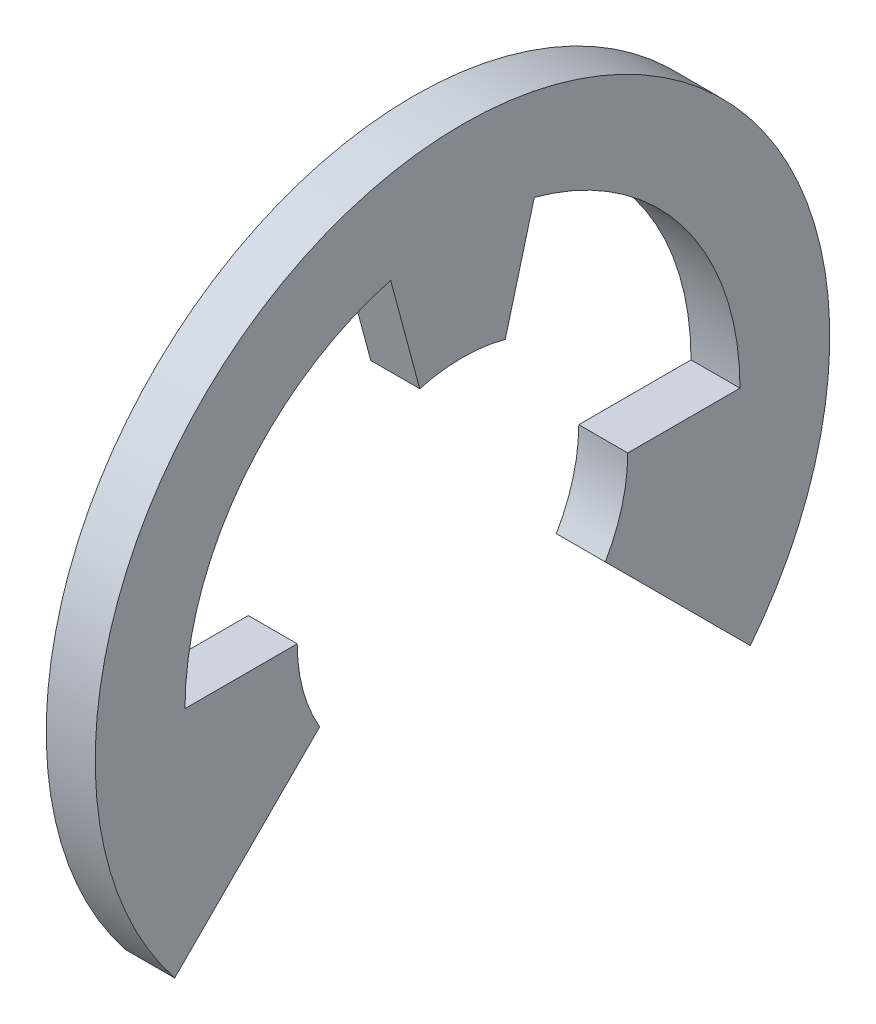
ISO-10303-21;
HEADER;
FILE_DESCRIPTION(('STEP AP214'),'2;1');
FILE_NAME('part.step','',(''),(''),'','','');
FILE_SCHEMA(('AUTOMOTIVE_DESIGN { 1 0 10303 214 1 1 1 1 }'));
ENDSEC;
DATA;
#1=APPLICATION_CONTEXT('core data for automotive mechanical design processes');
#2=APPLICATION_PROTOCOL_DEFINITION('international standard','automotive_design',2000,#1);
#3=PRODUCT_CONTEXT('',#1,'mechanical');
#4=PRODUCT('Part','Part','',(#3));
#5=PRODUCT_RELATED_PRODUCT_CATEGORY('part','',(#4));
#6=PRODUCT_DEFINITION_FORMATION('','',#4);
#7=PRODUCT_DEFINITION_CONTEXT('part definition',#1,'design');
#8=PRODUCT_DEFINITION('design','',#6,#7);
#9=PRODUCT_DEFINITION_SHAPE('','',#8);
#10=(LENGTH_UNIT() NAMED_UNIT(*) SI_UNIT(.MILLI.,.METRE.));
#11=(NAMED_UNIT(*) PLANE_ANGLE_UNIT() SI_UNIT($,.RADIAN.));
#12=(NAMED_UNIT(*) SI_UNIT($,.STERADIAN.) SOLID_ANGLE_UNIT());
#13=UNCERTAINTY_MEASURE_WITH_UNIT(LENGTH_MEASURE(1.E-05),#10,'distance_accuracy_value','');
#14=(GEOMETRIC_REPRESENTATION_CONTEXT(3) GLOBAL_UNCERTAINTY_ASSIGNED_CONTEXT((#13)) GLOBAL_UNIT_ASSIGNED_CONTEXT((#10,
#11,#12)) REPRESENTATION_CONTEXT('',''));
#15=CARTESIAN_POINT('',(0.,0.,0.));
#16=DIRECTION('',(0.,0.,1.));
#17=DIRECTION('',(1.,0.,0.));
#18=AXIS2_PLACEMENT_3D('',#15,#16,#17);
#19=CARTESIAN_POINT('',(0.6,0.,0.));
#20=DIRECTION('',(-1.,0.,0.));
#21=DIRECTION('',(0.,0.,1.));
#22=AXIS2_PLACEMENT_3D('',#19,#20,#21);
#23=CYLINDRICAL_SURFACE('',#22,2.025);
#24=CARTESIAN_POINT('',(0.,0.,0.));
#25=DIRECTION('',(-1.,0.,0.));
#26=DIRECTION('',(0.,0.,-1.));
#27=AXIS2_PLACEMENT_3D('',#24,#25,#26);
#28=CIRCLE('',#27,2.025);
#29=CARTESIAN_POINT('',(0.,-1.01888419361574,1.75));
#30=VERTEX_POINT('',#29);
#31=CARTESIAN_POINT('',(0.,0.,2.025));
#32=VERTEX_POINT('',#31);
#33=EDGE_CURVE('E155',#30,#32,#28,.T.);
#34=ORIENTED_EDGE('',*,*,#33,.T.);
#35=DIRECTION('',(-1.,0.,0.));
#36=VECTOR('',#35,1.);
#37=CARTESIAN_POINT('',(0.6,0.,2.025));
#38=LINE('',#37,#36);
#39=CARTESIAN_POINT('',(0.6,0.,2.025));
#40=VERTEX_POINT('',#39);
#41=EDGE_CURVE('E11',#40,#32,#38,.T.);
#42=ORIENTED_EDGE('',*,*,#41,.F.);
#43=CARTESIAN_POINT('',(0.6,0.,0.));
#44=DIRECTION('',(-1.,0.,0.));
#45=DIRECTION('',(0.,0.,-1.));
#46=AXIS2_PLACEMENT_3D('',#43,#44,#45);
#47=CIRCLE('',#46,2.025);
#48=CARTESIAN_POINT('',(0.6,-1.01888419361574,1.75));
#49=VERTEX_POINT('',#48);
#50=EDGE_CURVE('E177',#49,#40,#47,.T.);
#51=ORIENTED_EDGE('',*,*,#50,.F.);
#52=DIRECTION('',(-1.,0.,0.));
#53=VECTOR('',#52,1.);
#54=CARTESIAN_POINT('',(0.6,-1.01888419361574,1.75));
#55=LINE('',#54,#53);
#56=EDGE_CURVE('E151',#49,#30,#55,.T.);
#57=ORIENTED_EDGE('',*,*,#56,.T.);
#58=EDGE_LOOP('',(#34,#42,#51,#57));
#59=FACE_BOUND('',#58,.T.);
#60=ADVANCED_FACE('F35',(#59),#23,.F.);
#61=CARTESIAN_POINT('',(0.6,0.,2.025));
#62=DIRECTION('',(0.,-1.,0.));
#63=DIRECTION('',(0.,0.,-1.));
#64=AXIS2_PLACEMENT_3D('',#61,#62,#63);
#65=PLANE('',#64);
#66=DIRECTION('',(0.,0.,1.));
#67=VECTOR('',#66,1.);
#68=CARTESIAN_POINT('',(0.,0.,2.025));
#69=LINE('',#68,#67);
#70=CARTESIAN_POINT('',(0.,0.,3.4));
#71=VERTEX_POINT('',#70);
#72=EDGE_CURVE('E158',#32,#71,#69,.T.);
#73=ORIENTED_EDGE('',*,*,#72,.T.);
#74=DIRECTION('',(-1.,0.,0.));
#75=VECTOR('',#74,1.);
#76=CARTESIAN_POINT('',(0.6,0.,3.4));
#77=LINE('',#76,#75);
#78=CARTESIAN_POINT('',(0.6,0.,3.4));
#79=VERTEX_POINT('',#78);
#80=EDGE_CURVE('E43',#79,#71,#77,.T.);
#81=ORIENTED_EDGE('',*,*,#80,.F.);
#82=DIRECTION('',(0.,0.,1.));
#83=VECTOR('',#82,1.);
#84=CARTESIAN_POINT('',(0.6,0.,2.025));
#85=LINE('',#84,#83);
#86=EDGE_CURVE('E106',#40,#79,#85,.T.);
#87=ORIENTED_EDGE('',*,*,#86,.F.);
#88=ORIENTED_EDGE('',*,*,#41,.T.);
#89=EDGE_LOOP('',(#73,#81,#87,#88));
#90=FACE_BOUND('',#89,.T.);
#91=ADVANCED_FACE('F255',(#90),#65,.F.);
#92=CARTESIAN_POINT('',(0.6,0.,0.));
#93=DIRECTION('',(-1.,0.,0.));
#94=DIRECTION('',(0.,0.,1.));
#95=AXIS2_PLACEMENT_3D('',#92,#93,#94);
#96=CYLINDRICAL_SURFACE('',#95,3.4);
#97=CARTESIAN_POINT('',(0.,0.,0.));
#98=DIRECTION('',(-1.,0.,0.));
#99=DIRECTION('',(0.,0.,-1.));
#100=AXIS2_PLACEMENT_3D('',#97,#98,#99);
#101=CIRCLE('',#100,3.4);
#102=CARTESIAN_POINT('',(0.,3.28414780938282,0.879984753348611));
#103=VERTEX_POINT('',#102);
#104=EDGE_CURVE('E160',#71,#103,#101,.T.);
#105=ORIENTED_EDGE('',*,*,#104,.T.);
#106=DIRECTION('',(-1.,0.,0.));
#107=VECTOR('',#106,1.);
#108=CARTESIAN_POINT('',(0.6,3.28414780938282,0.879984753348611));
#109=LINE('',#108,#107);
#110=CARTESIAN_POINT('',(0.6,3.28414780938282,0.879984753348611));
#111=VERTEX_POINT('',#110);
#112=EDGE_CURVE('E196',#111,#103,#109,.T.);
#113=ORIENTED_EDGE('',*,*,#112,.F.);
#114=CARTESIAN_POINT('',(0.6,0.,0.));
#115=DIRECTION('',(-1.,0.,0.));
#116=DIRECTION('',(0.,0.,-1.));
#117=AXIS2_PLACEMENT_3D('',#114,#115,#116);
#118=CIRCLE('',#117,3.4);
#119=EDGE_CURVE('E204',#79,#111,#118,.T.);
#120=ORIENTED_EDGE('',*,*,#119,.F.);
#121=ORIENTED_EDGE('',*,*,#80,.T.);
#122=EDGE_LOOP('',(#105,#113,#120,#121));
#123=FACE_BOUND('',#122,.T.);
#124=ADVANCED_FACE('F202',(#123),#96,.F.);
#125=CARTESIAN_POINT('',(0.6,1.95599979823536,0.524108566332629));
#126=DIRECTION('',(0.,0.258819045102533,-0.965925826289065));
#127=DIRECTION('',(0.,0.965925826289065,0.258819045102533));
#128=AXIS2_PLACEMENT_3D('',#125,#126,#127);
#129=PLANE('',#128);
#130=DIRECTION('',(0.,-0.965925826289065,-0.258819045102533));
#131=VECTOR('',#130,1.);
#132=CARTESIAN_POINT('',(0.,1.95599979823536,0.524108566332629));
#133=LINE('',#132,#131);
#134=CARTESIAN_POINT('',(0.,1.95599979823536,0.524108566332629));
#135=VERTEX_POINT('',#134);
#136=EDGE_CURVE('E162',#103,#135,#133,.T.);
#137=ORIENTED_EDGE('',*,*,#136,.T.);
#138=DIRECTION('',(-1.,0.,0.));
#139=VECTOR('',#138,1.);
#140=CARTESIAN_POINT('',(0.6,1.95599979823536,0.524108566332629));
#141=LINE('',#140,#139);
#142=CARTESIAN_POINT('',(0.6,1.95599979823536,0.524108566332629));
#143=VERTEX_POINT('',#142);
#144=EDGE_CURVE('E193',#143,#135,#141,.T.);
#145=ORIENTED_EDGE('',*,*,#144,.F.);
#146=DIRECTION('',(0.,-0.965925826289065,-0.258819045102533));
#147=VECTOR('',#146,1.);
#148=CARTESIAN_POINT('',(0.6,1.95599979823536,0.524108566332629));
#149=LINE('',#148,#147);
#150=EDGE_CURVE('E222',#111,#143,#149,.T.);
#151=ORIENTED_EDGE('',*,*,#150,.F.);
#152=ORIENTED_EDGE('',*,*,#112,.T.);
#153=EDGE_LOOP('',(#137,#145,#151,#152));
#154=FACE_BOUND('',#153,.T.);
#155=ADVANCED_FACE('F213',(#154),#129,.F.);
#156=CARTESIAN_POINT('',(0.6,0.,0.));
#157=DIRECTION('',(-1.,0.,0.));
#158=DIRECTION('',(0.,0.,1.));
#159=AXIS2_PLACEMENT_3D('',#156,#157,#158);
#160=CYLINDRICAL_SURFACE('',#159,2.025);
#161=CARTESIAN_POINT('',(0.,0.,0.));
#162=DIRECTION('',(-1.,0.,0.));
#163=DIRECTION('',(0.,0.,-1.));
#164=AXIS2_PLACEMENT_3D('',#161,#162,#163);
#165=CIRCLE('',#164,2.025);
#166=CARTESIAN_POINT('',(0.,1.95599979823536,-0.524108566332629));
#167=VERTEX_POINT('',#166);
#168=EDGE_CURVE('E164',#135,#167,#165,.T.);
#169=ORIENTED_EDGE('',*,*,#168,.T.);
#170=DIRECTION('',(-1.,0.,0.));
#171=VECTOR('',#170,1.);
#172=CARTESIAN_POINT('',(0.6,1.95599979823536,-0.524108566332629));
#173=LINE('',#172,#171);
#174=CARTESIAN_POINT('',(0.6,1.95599979823536,-0.524108566332629));
#175=VERTEX_POINT('',#174);
#176=EDGE_CURVE('E190',#175,#167,#173,.T.);
#177=ORIENTED_EDGE('',*,*,#176,.F.);
#178=CARTESIAN_POINT('',(0.6,0.,0.));
#179=DIRECTION('',(-1.,0.,0.));
#180=DIRECTION('',(0.,0.,-1.));
#181=AXIS2_PLACEMENT_3D('',#178,#179,#180);
#182=CIRCLE('',#181,2.025);
#183=EDGE_CURVE('E219',#143,#175,#182,.T.);
#184=ORIENTED_EDGE('',*,*,#183,.F.);
#185=ORIENTED_EDGE('',*,*,#144,.T.);
#186=EDGE_LOOP('',(#169,#177,#184,#185));
#187=FACE_BOUND('',#186,.T.);
#188=ADVANCED_FACE('F217',(#187),#160,.F.);
#189=CARTESIAN_POINT('',(0.6,3.28414780938282,-0.879984753348611));
#190=DIRECTION('',(0.,0.258819045102533,0.965925826289065));
#191=DIRECTION('',(0.,-0.965925826289065,0.258819045102533));
#192=AXIS2_PLACEMENT_3D('',#189,#190,#191);
#193=PLANE('',#192);
#194=DIRECTION('',(0.,0.965925826289065,-0.258819045102533));
#195=VECTOR('',#194,1.);
#196=CARTESIAN_POINT('',(0.,3.28414780938282,-0.879984753348611));
#197=LINE('',#196,#195);
#198=CARTESIAN_POINT('',(0.,3.28414780938282,-0.879984753348611));
#199=VERTEX_POINT('',#198);
#200=EDGE_CURVE('E166',#167,#199,#197,.T.);
#201=ORIENTED_EDGE('',*,*,#200,.T.);
#202=DIRECTION('',(-1.,0.,0.));
#203=VECTOR('',#202,1.);
#204=CARTESIAN_POINT('',(0.6,3.28414780938282,-0.879984753348611));
#205=LINE('',#204,#203);
#206=CARTESIAN_POINT('',(0.6,3.28414780938282,-0.879984753348611));
#207=VERTEX_POINT('',#206);
#208=EDGE_CURVE('E187',#207,#199,#205,.T.);
#209=ORIENTED_EDGE('',*,*,#208,.F.);
#210=DIRECTION('',(0.,0.965925826289065,-0.258819045102533));
#211=VECTOR('',#210,1.);
#212=CARTESIAN_POINT('',(0.6,3.28414780938282,-0.879984753348611));
#213=LINE('',#212,#211);
#214=EDGE_CURVE('E221',#175,#207,#213,.T.);
#215=ORIENTED_EDGE('',*,*,#214,.F.);
#216=ORIENTED_EDGE('',*,*,#176,.T.);
#217=EDGE_LOOP('',(#201,#209,#215,#216));
#218=FACE_BOUND('',#217,.T.);
#219=ADVANCED_FACE('F268',(#218),#193,.F.);
#220=CARTESIAN_POINT('',(0.6,0.,0.));
#221=DIRECTION('',(-1.,0.,0.));
#222=DIRECTION('',(0.,0.,1.));
#223=AXIS2_PLACEMENT_3D('',#220,#221,#222);
#224=CYLINDRICAL_SURFACE('',#223,3.4);
#225=CARTESIAN_POINT('',(0.,0.,0.));
#226=DIRECTION('',(-1.,0.,0.));
#227=DIRECTION('',(0.,0.,-1.));
#228=AXIS2_PLACEMENT_3D('',#225,#226,#227);
#229=CIRCLE('',#228,3.4);
#230=CARTESIAN_POINT('',(0.,0.,-3.4));
#231=VERTEX_POINT('',#230);
#232=EDGE_CURVE('E168',#199,#231,#229,.T.);
#233=ORIENTED_EDGE('',*,*,#232,.T.);
#234=DIRECTION('',(-1.,0.,0.));
#235=VECTOR('',#234,1.);
#236=CARTESIAN_POINT('',(0.6,0.,-3.4));
#237=LINE('',#236,#235);
#238=CARTESIAN_POINT('',(0.6,0.,-3.4));
#239=VERTEX_POINT('',#238);
#240=EDGE_CURVE('E184',#239,#231,#237,.T.);
#241=ORIENTED_EDGE('',*,*,#240,.F.);
#242=CARTESIAN_POINT('',(0.6,0.,0.));
#243=DIRECTION('',(-1.,0.,0.));
#244=DIRECTION('',(0.,0.,-1.));
#245=AXIS2_PLACEMENT_3D('',#242,#243,#244);
#246=CIRCLE('',#245,3.4);
#247=EDGE_CURVE('E224',#207,#239,#246,.T.);
#248=ORIENTED_EDGE('',*,*,#247,.F.);
#249=ORIENTED_EDGE('',*,*,#208,.T.);
#250=EDGE_LOOP('',(#233,#241,#248,#249));
#251=FACE_BOUND('',#250,.T.);
#252=ADVANCED_FACE('F271',(#251),#224,.F.);
#253=CARTESIAN_POINT('',(0.6,0.,-2.025));
#254=DIRECTION('',(0.,-1.,0.));
#255=DIRECTION('',(0.,0.,-1.));
#256=AXIS2_PLACEMENT_3D('',#253,#254,#255);
#257=PLANE('',#256);
#258=DIRECTION('',(0.,0.,1.));
#259=VECTOR('',#258,1.);
#260=CARTESIAN_POINT('',(0.,0.,-2.025));
#261=LINE('',#260,#259);
#262=CARTESIAN_POINT('',(0.,0.,-2.025));
#263=VERTEX_POINT('',#262);
#264=EDGE_CURVE('E170',#231,#263,#261,.T.);
#265=ORIENTED_EDGE('',*,*,#264,.T.);
#266=DIRECTION('',(-1.,0.,0.));
#267=VECTOR('',#266,1.);
#268=CARTESIAN_POINT('',(0.6,0.,-2.025));
#269=LINE('',#268,#267);
#270=CARTESIAN_POINT('',(0.6,0.,-2.025));
#271=VERTEX_POINT('',#270);
#272=EDGE_CURVE('E181',#271,#263,#269,.T.);
#273=ORIENTED_EDGE('',*,*,#272,.F.);
#274=DIRECTION('',(0.,0.,1.));
#275=VECTOR('',#274,1.);
#276=CARTESIAN_POINT('',(0.6,0.,-2.025));
#277=LINE('',#276,#275);
#278=EDGE_CURVE('E230',#239,#271,#277,.T.);
#279=ORIENTED_EDGE('',*,*,#278,.F.);
#280=ORIENTED_EDGE('',*,*,#240,.T.);
#281=EDGE_LOOP('',(#265,#273,#279,#280));
#282=FACE_BOUND('',#281,.T.);
#283=ADVANCED_FACE('F236',(#282),#257,.F.);
#284=CARTESIAN_POINT('',(0.6,0.,0.));
#285=DIRECTION('',(-1.,0.,0.));
#286=DIRECTION('',(0.,0.,1.));
#287=AXIS2_PLACEMENT_3D('',#284,#285,#286);
#288=CYLINDRICAL_SURFACE('',#287,2.025);
#289=CARTESIAN_POINT('',(0.,0.,0.));
#290=DIRECTION('',(-1.,0.,0.));
#291=DIRECTION('',(0.,0.,-1.));
#292=AXIS2_PLACEMENT_3D('',#289,#290,#291);
#293=CIRCLE('',#292,2.025);
#294=CARTESIAN_POINT('',(0.,-1.01888419361574,-1.75));
#295=VERTEX_POINT('',#294);
#296=EDGE_CURVE('E172',#263,#295,#293,.T.);
#297=ORIENTED_EDGE('',*,*,#296,.T.);
#298=DIRECTION('',(-1.,0.,0.));
#299=VECTOR('',#298,1.);
#300=CARTESIAN_POINT('',(0.6,-1.01888419361574,-1.75));
#301=LINE('',#300,#299);
#302=CARTESIAN_POINT('',(0.6,-1.01888419361574,-1.75));
#303=VERTEX_POINT('',#302);
#304=EDGE_CURVE('E146',#303,#295,#301,.T.);
#305=ORIENTED_EDGE('',*,*,#304,.F.);
#306=CARTESIAN_POINT('',(0.6,0.,0.));
#307=DIRECTION('',(-1.,0.,0.));
#308=DIRECTION('',(0.,0.,-1.));
#309=AXIS2_PLACEMENT_3D('',#306,#307,#308);
#310=CIRCLE('',#309,2.025);
#311=EDGE_CURVE('E137',#271,#303,#310,.T.);
#312=ORIENTED_EDGE('',*,*,#311,.F.);
#313=ORIENTED_EDGE('',*,*,#272,.T.);
#314=EDGE_LOOP('',(#297,#305,#312,#313));
#315=FACE_BOUND('',#314,.T.);
#316=ADVANCED_FACE('F240',(#315),#288,.F.);
#317=CARTESIAN_POINT('',(0.6,-1.01888419361574,-1.75));
#318=DIRECTION('',(0.,0.707106781186547,-0.707106781186548));
#319=DIRECTION('',(0.,0.707106781186548,0.707106781186547));
#320=AXIS2_PLACEMENT_3D('',#317,#318,#319);
#321=PLANE('',#320);
#322=DIRECTION('',(0.,-0.707106781186548,-0.707106781186547));
#323=VECTOR('',#322,1.);
#324=CARTESIAN_POINT('',(0.,-1.01888419361574,-1.75));
#325=LINE('',#324,#323);
#326=CARTESIAN_POINT('',(0.,-2.79535453144028,-3.52647033782454));
#327=VERTEX_POINT('',#326);
#328=EDGE_CURVE('E145',#295,#327,#325,.T.);
#329=ORIENTED_EDGE('',*,*,#328,.T.);
#330=DIRECTION('',(-1.,0.,0.));
#331=VECTOR('',#330,1.);
#332=CARTESIAN_POINT('',(0.6,-2.79535453144028,-3.52647033782454));
#333=LINE('',#332,#331);
#334=CARTESIAN_POINT('',(0.6,-2.79535453144028,-3.52647033782454));
#335=VERTEX_POINT('',#334);
#336=EDGE_CURVE('E142',#335,#327,#333,.T.);
#337=ORIENTED_EDGE('',*,*,#336,.F.);
#338=DIRECTION('',(0.,-0.707106781186548,-0.707106781186547));
#339=VECTOR('',#338,1.);
#340=CARTESIAN_POINT('',(0.6,-1.01888419361574,-1.75));
#341=LINE('',#340,#339);
#342=EDGE_CURVE('E131',#303,#335,#341,.T.);
#343=ORIENTED_EDGE('',*,*,#342,.F.);
#344=ORIENTED_EDGE('',*,*,#304,.T.);
#345=EDGE_LOOP('',(#329,#337,#343,#344));
#346=FACE_BOUND('',#345,.T.);
#347=ADVANCED_FACE('F143',(#346),#321,.F.);
#348=CARTESIAN_POINT('',(0.6,0.,0.));
#349=DIRECTION('',(-1.,0.,0.));
#350=DIRECTION('',(0.,0.,1.));
#351=AXIS2_PLACEMENT_3D('',#348,#349,#350);
#352=CYLINDRICAL_SURFACE('',#351,4.5);
#353=CARTESIAN_POINT('',(0.,0.,0.));
#354=DIRECTION('',(1.,0.,0.));
#355=DIRECTION('',(0.,0.,-1.));
#356=AXIS2_PLACEMENT_3D('',#353,#354,#355);
#357=CIRCLE('',#356,4.5);
#358=CARTESIAN_POINT('',(0.,-2.79535453144028,3.52647033782454));
#359=VERTEX_POINT('',#358);
#360=EDGE_CURVE('E92',#327,#359,#357,.T.);
#361=ORIENTED_EDGE('',*,*,#360,.T.);
#362=DIRECTION('',(-1.,0.,0.));
#363=VECTOR('',#362,1.);
#364=CARTESIAN_POINT('',(0.6,-2.79535453144028,3.52647033782454));
#365=LINE('',#364,#363);
#366=CARTESIAN_POINT('',(0.6,-2.79535453144028,3.52647033782454));
#367=VERTEX_POINT('',#366);
#368=EDGE_CURVE('E147',#367,#359,#365,.T.);
#369=ORIENTED_EDGE('',*,*,#368,.F.);
#370=CARTESIAN_POINT('',(0.6,0.,0.));
#371=DIRECTION('',(1.,0.,0.));
#372=DIRECTION('',(0.,0.,-1.));
#373=AXIS2_PLACEMENT_3D('',#370,#371,#372);
#374=CIRCLE('',#373,4.5);
#375=EDGE_CURVE('E135',#335,#367,#374,.T.);
#376=ORIENTED_EDGE('',*,*,#375,.F.);
#377=ORIENTED_EDGE('',*,*,#336,.T.);
#378=EDGE_LOOP('',(#361,#369,#376,#377));
#379=FACE_BOUND('',#378,.T.);
#380=ADVANCED_FACE('F149',(#379),#352,.T.);
#381=CARTESIAN_POINT('',(0.6,-1.01888419361574,1.75));
#382=DIRECTION('',(0.,0.707106781186547,0.707106781186548));
#383=DIRECTION('',(0.,-0.707106781186548,0.707106781186547));
#384=AXIS2_PLACEMENT_3D('',#381,#382,#383);
#385=PLANE('',#384);
#386=DIRECTION('',(0.,0.707106781186548,-0.707106781186547));
#387=VECTOR('',#386,1.);
#388=CARTESIAN_POINT('',(0.,-1.01888419361574,1.75));
#389=LINE('',#388,#387);
#390=EDGE_CURVE('E98',#359,#30,#389,.T.);
#391=ORIENTED_EDGE('',*,*,#390,.T.);
#392=ORIENTED_EDGE('',*,*,#56,.F.);
#393=DIRECTION('',(0.,0.707106781186548,-0.707106781186547));
#394=VECTOR('',#393,1.);
#395=CARTESIAN_POINT('',(0.6,-1.01888419361574,1.75));
#396=LINE('',#395,#394);
#397=EDGE_CURVE('E51',#367,#49,#396,.T.);
#398=ORIENTED_EDGE('',*,*,#397,.F.);
#399=ORIENTED_EDGE('',*,*,#368,.T.);
#400=EDGE_LOOP('',(#391,#392,#398,#399));
#401=FACE_BOUND('',#400,.T.);
#402=ADVANCED_FACE('F244',(#401),#385,.F.);
#403=CARTESIAN_POINT('',(0.6,0.,0.));
#404=DIRECTION('',(1.,0.,0.));
#405=DIRECTION('',(0.,0.,-1.));
#406=AXIS2_PLACEMENT_3D('',#403,#404,#405);
#407=PLANE('',#406);
#408=ORIENTED_EDGE('',*,*,#50,.T.);
#409=ORIENTED_EDGE('',*,*,#86,.T.);
#410=ORIENTED_EDGE('',*,*,#119,.T.);
#411=ORIENTED_EDGE('',*,*,#150,.T.);
#412=ORIENTED_EDGE('',*,*,#183,.T.);
#413=ORIENTED_EDGE('',*,*,#214,.T.);
#414=ORIENTED_EDGE('',*,*,#247,.T.);
#415=ORIENTED_EDGE('',*,*,#278,.T.);
#416=ORIENTED_EDGE('',*,*,#311,.T.);
#417=ORIENTED_EDGE('',*,*,#342,.T.);
#418=ORIENTED_EDGE('',*,*,#375,.T.);
#419=ORIENTED_EDGE('',*,*,#397,.T.);
#420=EDGE_LOOP('',(#408,#409,#410,#411,#412,#413,#414,#415,#416,#417,#418,#419));
#421=FACE_BOUND('',#420,.T.);
#422=ADVANCED_FACE('F133',(#421),#407,.T.);
#423=CARTESIAN_POINT('',(0.,0.,0.));
#424=DIRECTION('',(1.,0.,0.));
#425=DIRECTION('',(0.,0.,-1.));
#426=AXIS2_PLACEMENT_3D('',#423,#424,#425);
#427=PLANE('',#426);
#428=ORIENTED_EDGE('',*,*,#33,.F.);
#429=ORIENTED_EDGE('',*,*,#390,.F.);
#430=ORIENTED_EDGE('',*,*,#360,.F.);
#431=ORIENTED_EDGE('',*,*,#328,.F.);
#432=ORIENTED_EDGE('',*,*,#296,.F.);
#433=ORIENTED_EDGE('',*,*,#264,.F.);
#434=ORIENTED_EDGE('',*,*,#232,.F.);
#435=ORIENTED_EDGE('',*,*,#200,.F.);
#436=ORIENTED_EDGE('',*,*,#168,.F.);
#437=ORIENTED_EDGE('',*,*,#136,.F.);
#438=ORIENTED_EDGE('',*,*,#104,.F.);
#439=ORIENTED_EDGE('',*,*,#72,.F.);
#440=EDGE_LOOP('',(#428,#429,#430,#431,#432,#433,#434,#435,#436,#437,#438,#439));
#441=FACE_BOUND('',#440,.T.);
#442=ADVANCED_FACE('F208',(#441),#427,.F.);
#443=CLOSED_SHELL('',(#60,#91,#124,#155,#188,#219,#252,#283,#316,#347,#380,#402,#422,#442));
#444=MANIFOLD_SOLID_BREP('B2',#443);
#445=ADVANCED_BREP_SHAPE_REPRESENTATION('',(#18,#444),#14);
#446=SHAPE_DEFINITION_REPRESENTATION(#9,#445);
ENDSEC;
END-ISO-10303-21;
